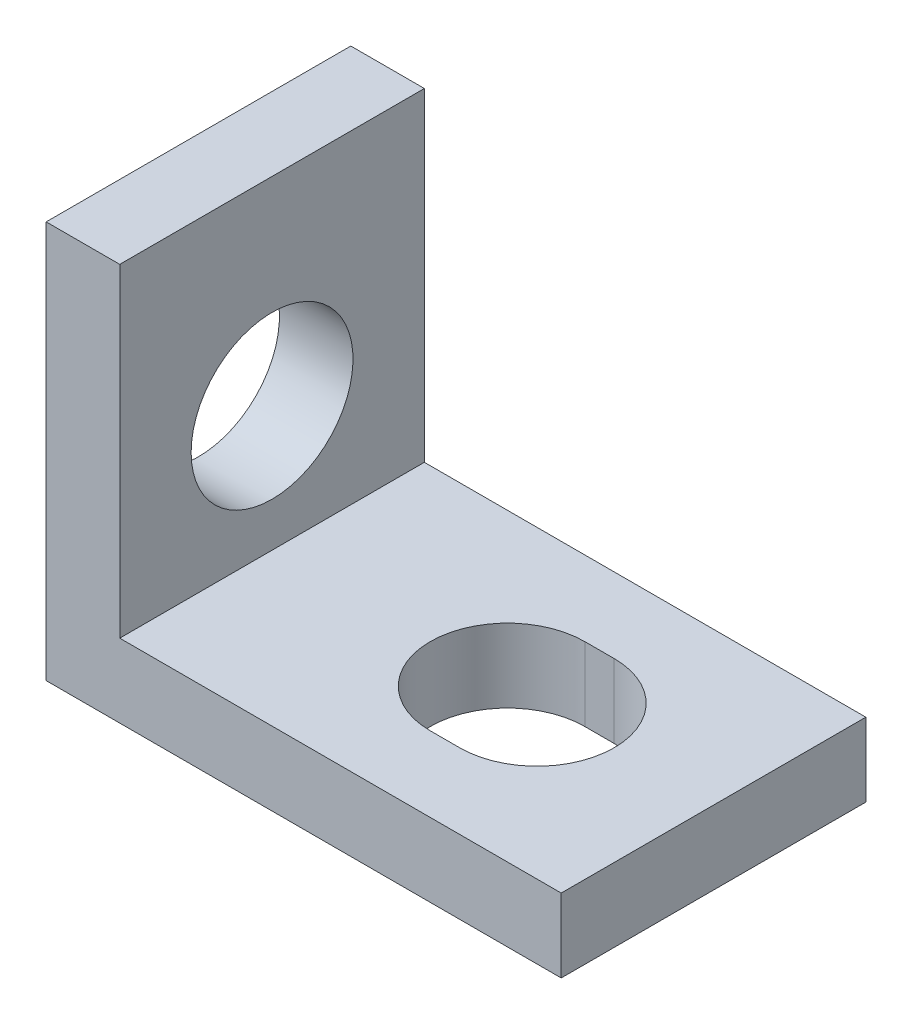
ISO-10303-21;
HEADER;
FILE_DESCRIPTION(('STEP AP214'),'2;1');
FILE_NAME('part.step','',(''),(''),'','','');
FILE_SCHEMA(('AUTOMOTIVE_DESIGN { 1 0 10303 214 1 1 1 1 }'));
ENDSEC;
DATA;
#1=APPLICATION_CONTEXT('core data for automotive mechanical design processes');
#2=APPLICATION_PROTOCOL_DEFINITION('international standard','automotive_design',2000,#1);
#3=PRODUCT_CONTEXT('',#1,'mechanical');
#4=PRODUCT('Part','Part','',(#3));
#5=PRODUCT_RELATED_PRODUCT_CATEGORY('part','',(#4));
#6=PRODUCT_DEFINITION_FORMATION('','',#4);
#7=PRODUCT_DEFINITION_CONTEXT('part definition',#1,'design');
#8=PRODUCT_DEFINITION('design','',#6,#7);
#9=PRODUCT_DEFINITION_SHAPE('','',#8);
#10=(LENGTH_UNIT() NAMED_UNIT(*) SI_UNIT(.MILLI.,.METRE.));
#11=(NAMED_UNIT(*) PLANE_ANGLE_UNIT() SI_UNIT($,.RADIAN.));
#12=(NAMED_UNIT(*) SI_UNIT($,.STERADIAN.) SOLID_ANGLE_UNIT());
#13=UNCERTAINTY_MEASURE_WITH_UNIT(LENGTH_MEASURE(1.E-05),#10,'distance_accuracy_value','');
#14=(GEOMETRIC_REPRESENTATION_CONTEXT(3) GLOBAL_UNCERTAINTY_ASSIGNED_CONTEXT((#13)) GLOBAL_UNIT_ASSIGNED_CONTEXT((#10,
#11,#12)) REPRESENTATION_CONTEXT('',''));
#15=CARTESIAN_POINT('',(0.,0.,0.));
#16=DIRECTION('',(0.,0.,1.));
#17=DIRECTION('',(1.,0.,0.));
#18=AXIS2_PLACEMENT_3D('',#15,#16,#17);
#19=CARTESIAN_POINT('',(7.,0.,4.14));
#20=DIRECTION('',(0.,1.,0.));
#21=DIRECTION('',(-1.,0.,0.));
#22=AXIS2_PLACEMENT_3D('',#19,#20,#21);
#23=PLANE('',#22);
#24=DIRECTION('',(-1.,0.,0.));
#25=VECTOR('',#24,1.);
#26=CARTESIAN_POINT('',(4.6,0.,3.12));
#27=LINE('',#26,#25);
#28=CARTESIAN_POINT('',(4.6,0.,3.12));
#29=VERTEX_POINT('',#28);
#30=CARTESIAN_POINT('',(4.2,0.,3.12));
#31=VERTEX_POINT('',#30);
#32=EDGE_CURVE('E125',#29,#31,#27,.T.);
#33=ORIENTED_EDGE('',*,*,#32,.F.);
#34=CARTESIAN_POINT('',(4.6,0.,2.07));
#35=DIRECTION('',(0.,-1.,0.));
#36=DIRECTION('',(1.,0.,0.));
#37=AXIS2_PLACEMENT_3D('',#34,#35,#36);
#38=CIRCLE('',#37,1.05);
#39=CARTESIAN_POINT('',(4.6,0.,1.02));
#40=VERTEX_POINT('',#39);
#41=EDGE_CURVE('E51',#40,#29,#38,.T.);
#42=ORIENTED_EDGE('',*,*,#41,.F.);
#43=DIRECTION('',(1.,0.,0.));
#44=VECTOR('',#43,1.);
#45=CARTESIAN_POINT('',(4.6,0.,1.02));
#46=LINE('',#45,#44);
#47=CARTESIAN_POINT('',(4.2,0.,1.02));
#48=VERTEX_POINT('',#47);
#49=EDGE_CURVE('E131',#48,#40,#46,.T.);
#50=ORIENTED_EDGE('',*,*,#49,.F.);
#51=CARTESIAN_POINT('',(4.2,0.,2.07));
#52=DIRECTION('',(0.,-1.,0.));
#53=DIRECTION('',(1.,0.,0.));
#54=AXIS2_PLACEMENT_3D('',#51,#52,#53);
#55=CIRCLE('',#54,1.05);
#56=EDGE_CURVE('E116',#31,#48,#55,.T.);
#57=ORIENTED_EDGE('',*,*,#56,.F.);
#58=EDGE_LOOP('',(#33,#42,#50,#57));
#59=FACE_BOUND('',#58,.T.);
#60=DIRECTION('',(1.,0.,0.));
#61=VECTOR('',#60,1.);
#62=CARTESIAN_POINT('',(7.,0.,0.));
#63=LINE('',#62,#61);
#64=CARTESIAN_POINT('',(0.,0.,0.));
#65=VERTEX_POINT('',#64);
#66=CARTESIAN_POINT('',(7.,0.,0.));
#67=VERTEX_POINT('',#66);
#68=EDGE_CURVE('E146',#65,#67,#63,.T.);
#69=ORIENTED_EDGE('',*,*,#68,.T.);
#70=DIRECTION('',(0.,0.,-1.));
#71=VECTOR('',#70,1.);
#72=CARTESIAN_POINT('',(7.,0.,4.14));
#73=LINE('',#72,#71);
#74=CARTESIAN_POINT('',(7.,0.,4.14));
#75=VERTEX_POINT('',#74);
#76=EDGE_CURVE('E187',#75,#67,#73,.T.);
#77=ORIENTED_EDGE('',*,*,#76,.F.);
#78=DIRECTION('',(1.,0.,0.));
#79=VECTOR('',#78,1.);
#80=CARTESIAN_POINT('',(7.,0.,4.14));
#81=LINE('',#80,#79);
#82=CARTESIAN_POINT('',(0.,0.,4.14));
#83=VERTEX_POINT('',#82);
#84=EDGE_CURVE('E147',#83,#75,#81,.T.);
#85=ORIENTED_EDGE('',*,*,#84,.F.);
#86=DIRECTION('',(0.,0.,-1.));
#87=VECTOR('',#86,1.);
#88=CARTESIAN_POINT('',(0.,0.,4.14));
#89=LINE('',#88,#87);
#90=EDGE_CURVE('E161',#83,#65,#89,.T.);
#91=ORIENTED_EDGE('',*,*,#90,.T.);
#92=EDGE_LOOP('',(#69,#77,#85,#91));
#93=FACE_BOUND('',#92,.T.);
#94=ADVANCED_FACE('F37',(#59,#93),#23,.F.);
#95=CARTESIAN_POINT('',(7.,1.,4.14));
#96=DIRECTION('',(-1.,0.,0.));
#97=DIRECTION('',(0.,0.,1.));
#98=AXIS2_PLACEMENT_3D('',#95,#96,#97);
#99=PLANE('',#98);
#100=DIRECTION('',(0.,1.,0.));
#101=VECTOR('',#100,1.);
#102=CARTESIAN_POINT('',(7.,1.,0.));
#103=LINE('',#102,#101);
#104=CARTESIAN_POINT('',(7.,1.,0.));
#105=VERTEX_POINT('',#104);
#106=EDGE_CURVE('E164',#67,#105,#103,.T.);
#107=ORIENTED_EDGE('',*,*,#106,.T.);
#108=DIRECTION('',(0.,0.,-1.));
#109=VECTOR('',#108,1.);
#110=CARTESIAN_POINT('',(7.,1.,4.14));
#111=LINE('',#110,#109);
#112=CARTESIAN_POINT('',(7.,1.,4.14));
#113=VERTEX_POINT('',#112);
#114=EDGE_CURVE('E184',#113,#105,#111,.T.);
#115=ORIENTED_EDGE('',*,*,#114,.F.);
#116=DIRECTION('',(0.,1.,0.));
#117=VECTOR('',#116,1.);
#118=CARTESIAN_POINT('',(7.,1.,4.14));
#119=LINE('',#118,#117);
#120=EDGE_CURVE('E150',#75,#113,#119,.T.);
#121=ORIENTED_EDGE('',*,*,#120,.F.);
#122=ORIENTED_EDGE('',*,*,#76,.T.);
#123=EDGE_LOOP('',(#107,#115,#121,#122));
#124=FACE_BOUND('',#123,.T.);
#125=ADVANCED_FACE('F213',(#124),#99,.F.);
#126=CARTESIAN_POINT('',(1.,1.,4.14));
#127=DIRECTION('',(0.,-1.,0.));
#128=DIRECTION('',(0.,0.,-1.));
#129=AXIS2_PLACEMENT_3D('',#126,#127,#128);
#130=PLANE('',#129);
#131=DIRECTION('',(1.,0.,0.));
#132=VECTOR('',#131,1.);
#133=CARTESIAN_POINT('',(1.,1.,1.02));
#134=LINE('',#133,#132);
#135=CARTESIAN_POINT('',(4.2,1.,1.02));
#136=VERTEX_POINT('',#135);
#137=CARTESIAN_POINT('',(4.6,1.,1.02));
#138=VERTEX_POINT('',#137);
#139=EDGE_CURVE('E44',#136,#138,#134,.T.);
#140=ORIENTED_EDGE('',*,*,#139,.T.);
#141=CARTESIAN_POINT('',(4.6,1.,2.07));
#142=DIRECTION('',(0.,-1.,0.));
#143=DIRECTION('',(0.,0.,-1.));
#144=AXIS2_PLACEMENT_3D('',#141,#142,#143);
#145=CIRCLE('',#144,1.05);
#146=CARTESIAN_POINT('',(4.6,1.,3.12));
#147=VERTEX_POINT('',#146);
#148=EDGE_CURVE('E11',#138,#147,#145,.T.);
#149=ORIENTED_EDGE('',*,*,#148,.T.);
#150=DIRECTION('',(-1.,0.,0.));
#151=VECTOR('',#150,1.);
#152=CARTESIAN_POINT('',(1.,1.,3.12));
#153=LINE('',#152,#151);
#154=CARTESIAN_POINT('',(4.2,1.,3.12));
#155=VERTEX_POINT('',#154);
#156=EDGE_CURVE('E190',#147,#155,#153,.T.);
#157=ORIENTED_EDGE('',*,*,#156,.T.);
#158=CARTESIAN_POINT('',(4.2,1.,2.07));
#159=DIRECTION('',(0.,-1.,0.));
#160=DIRECTION('',(0.,0.,-1.));
#161=AXIS2_PLACEMENT_3D('',#158,#159,#160);
#162=CIRCLE('',#161,1.05);
#163=EDGE_CURVE('E119',#155,#136,#162,.T.);
#164=ORIENTED_EDGE('',*,*,#163,.T.);
#165=EDGE_LOOP('',(#140,#149,#157,#164));
#166=FACE_BOUND('',#165,.T.);
#167=DIRECTION('',(-1.,0.,0.));
#168=VECTOR('',#167,1.);
#169=CARTESIAN_POINT('',(1.,1.,0.));
#170=LINE('',#169,#168);
#171=CARTESIAN_POINT('',(1.,1.,0.));
#172=VERTEX_POINT('',#171);
#173=EDGE_CURVE('E166',#105,#172,#170,.T.);
#174=ORIENTED_EDGE('',*,*,#173,.T.);
#175=DIRECTION('',(0.,0.,-1.));
#176=VECTOR('',#175,1.);
#177=CARTESIAN_POINT('',(1.,1.,4.14));
#178=LINE('',#177,#176);
#179=CARTESIAN_POINT('',(1.,1.,4.14));
#180=VERTEX_POINT('',#179);
#181=EDGE_CURVE('E181',#180,#172,#178,.T.);
#182=ORIENTED_EDGE('',*,*,#181,.F.);
#183=DIRECTION('',(-1.,0.,0.));
#184=VECTOR('',#183,1.);
#185=CARTESIAN_POINT('',(1.,1.,4.14));
#186=LINE('',#185,#184);
#187=EDGE_CURVE('E153',#113,#180,#186,.T.);
#188=ORIENTED_EDGE('',*,*,#187,.F.);
#189=ORIENTED_EDGE('',*,*,#114,.T.);
#190=EDGE_LOOP('',(#174,#182,#188,#189));
#191=FACE_BOUND('',#190,.T.);
#192=ADVANCED_FACE('F194',(#166,#191),#130,.F.);
#193=CARTESIAN_POINT('',(1.,5.4,4.14));
#194=DIRECTION('',(-1.,0.,0.));
#195=DIRECTION('',(0.,-1.,0.));
#196=AXIS2_PLACEMENT_3D('',#193,#194,#195);
#197=PLANE('',#196);
#198=CARTESIAN_POINT('',(1.,2.7,2.07));
#199=DIRECTION('',(-1.,0.,0.));
#200=DIRECTION('',(0.,-1.,0.));
#201=AXIS2_PLACEMENT_3D('',#198,#199,#200);
#202=CIRCLE('',#201,1.1);
#203=CARTESIAN_POINT('',(1.,1.6,2.07));
#204=VERTEX_POINT('',#203);
#205=EDGE_CURVE('E143',#204,#204,#202,.T.);
#206=ORIENTED_EDGE('',*,*,#205,.T.);
#207=EDGE_LOOP('',(#206));
#208=FACE_BOUND('',#207,.T.);
#209=DIRECTION('',(0.,1.,0.));
#210=VECTOR('',#209,1.);
#211=CARTESIAN_POINT('',(1.,5.4,0.));
#212=LINE('',#211,#210);
#213=CARTESIAN_POINT('',(1.,5.4,0.));
#214=VERTEX_POINT('',#213);
#215=EDGE_CURVE('E168',#172,#214,#212,.T.);
#216=ORIENTED_EDGE('',*,*,#215,.T.);
#217=DIRECTION('',(0.,0.,-1.));
#218=VECTOR('',#217,1.);
#219=CARTESIAN_POINT('',(1.,5.4,4.14));
#220=LINE('',#219,#218);
#221=CARTESIAN_POINT('',(1.,5.4,4.14));
#222=VERTEX_POINT('',#221);
#223=EDGE_CURVE('E178',#222,#214,#220,.T.);
#224=ORIENTED_EDGE('',*,*,#223,.F.);
#225=DIRECTION('',(0.,1.,0.));
#226=VECTOR('',#225,1.);
#227=CARTESIAN_POINT('',(1.,5.4,4.14));
#228=LINE('',#227,#226);
#229=EDGE_CURVE('E155',#180,#222,#228,.T.);
#230=ORIENTED_EDGE('',*,*,#229,.F.);
#231=ORIENTED_EDGE('',*,*,#181,.T.);
#232=EDGE_LOOP('',(#216,#224,#230,#231));
#233=FACE_BOUND('',#232,.T.);
#234=ADVANCED_FACE('F221',(#208,#233),#197,.F.);
#235=CARTESIAN_POINT('',(0.,5.4,4.14));
#236=DIRECTION('',(0.,-1.,0.));
#237=DIRECTION('',(0.,0.,-1.));
#238=AXIS2_PLACEMENT_3D('',#235,#236,#237);
#239=PLANE('',#238);
#240=DIRECTION('',(-1.,0.,0.));
#241=VECTOR('',#240,1.);
#242=CARTESIAN_POINT('',(0.,5.4,0.));
#243=LINE('',#242,#241);
#244=CARTESIAN_POINT('',(0.,5.4,0.));
#245=VERTEX_POINT('',#244);
#246=EDGE_CURVE('E170',#214,#245,#243,.T.);
#247=ORIENTED_EDGE('',*,*,#246,.T.);
#248=DIRECTION('',(0.,0.,-1.));
#249=VECTOR('',#248,1.);
#250=CARTESIAN_POINT('',(0.,5.4,4.14));
#251=LINE('',#250,#249);
#252=CARTESIAN_POINT('',(0.,5.4,4.14));
#253=VERTEX_POINT('',#252);
#254=EDGE_CURVE('E175',#253,#245,#251,.T.);
#255=ORIENTED_EDGE('',*,*,#254,.F.);
#256=DIRECTION('',(-1.,0.,0.));
#257=VECTOR('',#256,1.);
#258=CARTESIAN_POINT('',(0.,5.4,4.14));
#259=LINE('',#258,#257);
#260=EDGE_CURVE('E157',#222,#253,#259,.T.);
#261=ORIENTED_EDGE('',*,*,#260,.F.);
#262=ORIENTED_EDGE('',*,*,#223,.T.);
#263=EDGE_LOOP('',(#247,#255,#261,#262));
#264=FACE_BOUND('',#263,.T.);
#265=ADVANCED_FACE('F226',(#264),#239,.F.);
#266=CARTESIAN_POINT('',(0.,0.,4.14));
#267=DIRECTION('',(1.,0.,0.));
#268=DIRECTION('',(0.,0.,-1.));
#269=AXIS2_PLACEMENT_3D('',#266,#267,#268);
#270=PLANE('',#269);
#271=CARTESIAN_POINT('',(0.,2.7,2.07));
#272=DIRECTION('',(-1.,0.,0.));
#273=DIRECTION('',(0.,0.,1.));
#274=AXIS2_PLACEMENT_3D('',#271,#272,#273);
#275=CIRCLE('',#274,1.1);
#276=CARTESIAN_POINT('',(0.,2.7,3.17));
#277=VERTEX_POINT('',#276);
#278=EDGE_CURVE('E138',#277,#277,#275,.T.);
#279=ORIENTED_EDGE('',*,*,#278,.F.);
#280=EDGE_LOOP('',(#279));
#281=FACE_BOUND('',#280,.T.);
#282=DIRECTION('',(0.,-1.,0.));
#283=VECTOR('',#282,1.);
#284=CARTESIAN_POINT('',(0.,0.,0.));
#285=LINE('',#284,#283);
#286=EDGE_CURVE('E151',#245,#65,#285,.T.);
#287=ORIENTED_EDGE('',*,*,#286,.T.);
#288=ORIENTED_EDGE('',*,*,#90,.F.);
#289=DIRECTION('',(0.,-1.,0.));
#290=VECTOR('',#289,1.);
#291=CARTESIAN_POINT('',(0.,0.,4.14));
#292=LINE('',#291,#290);
#293=EDGE_CURVE('E159',#253,#83,#292,.T.);
#294=ORIENTED_EDGE('',*,*,#293,.F.);
#295=ORIENTED_EDGE('',*,*,#254,.T.);
#296=EDGE_LOOP('',(#287,#288,#294,#295));
#297=FACE_BOUND('',#296,.T.);
#298=ADVANCED_FACE('F230',(#281,#297),#270,.F.);
#299=CARTESIAN_POINT('',(0.,0.,4.14));
#300=DIRECTION('',(0.,0.,-1.));
#301=DIRECTION('',(-1.,0.,0.));
#302=AXIS2_PLACEMENT_3D('',#299,#300,#301);
#303=PLANE('',#302);
#304=ORIENTED_EDGE('',*,*,#84,.T.);
#305=ORIENTED_EDGE('',*,*,#120,.T.);
#306=ORIENTED_EDGE('',*,*,#187,.T.);
#307=ORIENTED_EDGE('',*,*,#229,.T.);
#308=ORIENTED_EDGE('',*,*,#260,.T.);
#309=ORIENTED_EDGE('',*,*,#293,.T.);
#310=EDGE_LOOP('',(#304,#305,#306,#307,#308,#309));
#311=FACE_BOUND('',#310,.T.);
#312=ADVANCED_FACE('F234',(#311),#303,.F.);
#313=CARTESIAN_POINT('',(0.,0.,0.));
#314=DIRECTION('',(0.,0.,-1.));
#315=DIRECTION('',(-1.,0.,0.));
#316=AXIS2_PLACEMENT_3D('',#313,#314,#315);
#317=PLANE('',#316);
#318=ORIENTED_EDGE('',*,*,#68,.F.);
#319=ORIENTED_EDGE('',*,*,#286,.F.);
#320=ORIENTED_EDGE('',*,*,#246,.F.);
#321=ORIENTED_EDGE('',*,*,#215,.F.);
#322=ORIENTED_EDGE('',*,*,#173,.F.);
#323=ORIENTED_EDGE('',*,*,#106,.F.);
#324=EDGE_LOOP('',(#318,#319,#320,#321,#322,#323));
#325=FACE_BOUND('',#324,.T.);
#326=ADVANCED_FACE('F208',(#325),#317,.T.);
#327=CARTESIAN_POINT('',(7.,2.7,2.07));
#328=DIRECTION('',(-1.,0.,0.));
#329=DIRECTION('',(0.,0.,1.));
#330=AXIS2_PLACEMENT_3D('',#327,#328,#329);
#331=CYLINDRICAL_SURFACE('',#330,1.1);
#332=ORIENTED_EDGE('',*,*,#278,.T.);
#333=EDGE_LOOP('',(#332));
#334=FACE_BOUND('',#333,.T.);
#335=ORIENTED_EDGE('',*,*,#205,.F.);
#336=EDGE_LOOP('',(#335));
#337=FACE_BOUND('',#336,.T.);
#338=ADVANCED_FACE('F201',(#334,#337),#331,.F.);
#339=CARTESIAN_POINT('',(4.6,5.4,2.07));
#340=DIRECTION('',(0.,-1.,0.));
#341=DIRECTION('',(1.,0.,0.));
#342=AXIS2_PLACEMENT_3D('',#339,#340,#341);
#343=CYLINDRICAL_SURFACE('',#342,1.05);
#344=DIRECTION('',(0.,-1.,0.));
#345=VECTOR('',#344,1.);
#346=CARTESIAN_POINT('',(4.6,5.4,1.02));
#347=LINE('',#346,#345);
#348=EDGE_CURVE('E136',#138,#40,#347,.T.);
#349=ORIENTED_EDGE('',*,*,#348,.T.);
#350=ORIENTED_EDGE('',*,*,#41,.T.);
#351=DIRECTION('',(0.,-1.,0.));
#352=VECTOR('',#351,1.);
#353=CARTESIAN_POINT('',(4.6,5.4,3.12));
#354=LINE('',#353,#352);
#355=EDGE_CURVE('E122',#147,#29,#354,.T.);
#356=ORIENTED_EDGE('',*,*,#355,.F.);
#357=ORIENTED_EDGE('',*,*,#148,.F.);
#358=EDGE_LOOP('',(#349,#350,#356,#357));
#359=FACE_BOUND('',#358,.T.);
#360=ADVANCED_FACE('F199',(#359),#343,.F.);
#361=CARTESIAN_POINT('',(4.6,5.4,1.02));
#362=DIRECTION('',(0.,0.,-1.));
#363=DIRECTION('',(-1.,0.,0.));
#364=AXIS2_PLACEMENT_3D('',#361,#362,#363);
#365=PLANE('',#364);
#366=DIRECTION('',(0.,-1.,0.));
#367=VECTOR('',#366,1.);
#368=CARTESIAN_POINT('',(4.2,5.4,1.02));
#369=LINE('',#368,#367);
#370=EDGE_CURVE('E121',#136,#48,#369,.T.);
#371=ORIENTED_EDGE('',*,*,#370,.T.);
#372=ORIENTED_EDGE('',*,*,#49,.T.);
#373=ORIENTED_EDGE('',*,*,#348,.F.);
#374=ORIENTED_EDGE('',*,*,#139,.F.);
#375=EDGE_LOOP('',(#371,#372,#373,#374));
#376=FACE_BOUND('',#375,.T.);
#377=ADVANCED_FACE('F198',(#376),#365,.F.);
#378=CARTESIAN_POINT('',(4.2,5.4,2.07));
#379=DIRECTION('',(0.,-1.,0.));
#380=DIRECTION('',(1.,0.,0.));
#381=AXIS2_PLACEMENT_3D('',#378,#379,#380);
#382=CYLINDRICAL_SURFACE('',#381,1.05);
#383=DIRECTION('',(0.,-1.,0.));
#384=VECTOR('',#383,1.);
#385=CARTESIAN_POINT('',(4.2,5.4,3.12));
#386=LINE('',#385,#384);
#387=EDGE_CURVE('E59',#155,#31,#386,.T.);
#388=ORIENTED_EDGE('',*,*,#387,.T.);
#389=ORIENTED_EDGE('',*,*,#56,.T.);
#390=ORIENTED_EDGE('',*,*,#370,.F.);
#391=ORIENTED_EDGE('',*,*,#163,.F.);
#392=EDGE_LOOP('',(#388,#389,#390,#391));
#393=FACE_BOUND('',#392,.T.);
#394=ADVANCED_FACE('F113',(#393),#382,.F.);
#395=CARTESIAN_POINT('',(4.6,5.4,3.12));
#396=DIRECTION('',(0.,0.,1.));
#397=DIRECTION('',(1.,0.,0.));
#398=AXIS2_PLACEMENT_3D('',#395,#396,#397);
#399=PLANE('',#398);
#400=ORIENTED_EDGE('',*,*,#355,.T.);
#401=ORIENTED_EDGE('',*,*,#32,.T.);
#402=ORIENTED_EDGE('',*,*,#387,.F.);
#403=ORIENTED_EDGE('',*,*,#156,.F.);
#404=EDGE_LOOP('',(#400,#401,#402,#403));
#405=FACE_BOUND('',#404,.T.);
#406=ADVANCED_FACE('F126',(#405),#399,.F.);
#407=CLOSED_SHELL('',(#94,#125,#192,#234,#265,#298,#312,#326,#338,#360,#377,#394,#406));
#408=MANIFOLD_SOLID_BREP('B2',#407);
#409=ADVANCED_BREP_SHAPE_REPRESENTATION('',(#18,#408),#14);
#410=SHAPE_DEFINITION_REPRESENTATION(#9,#409);
ENDSEC;
END-ISO-10303-21;
